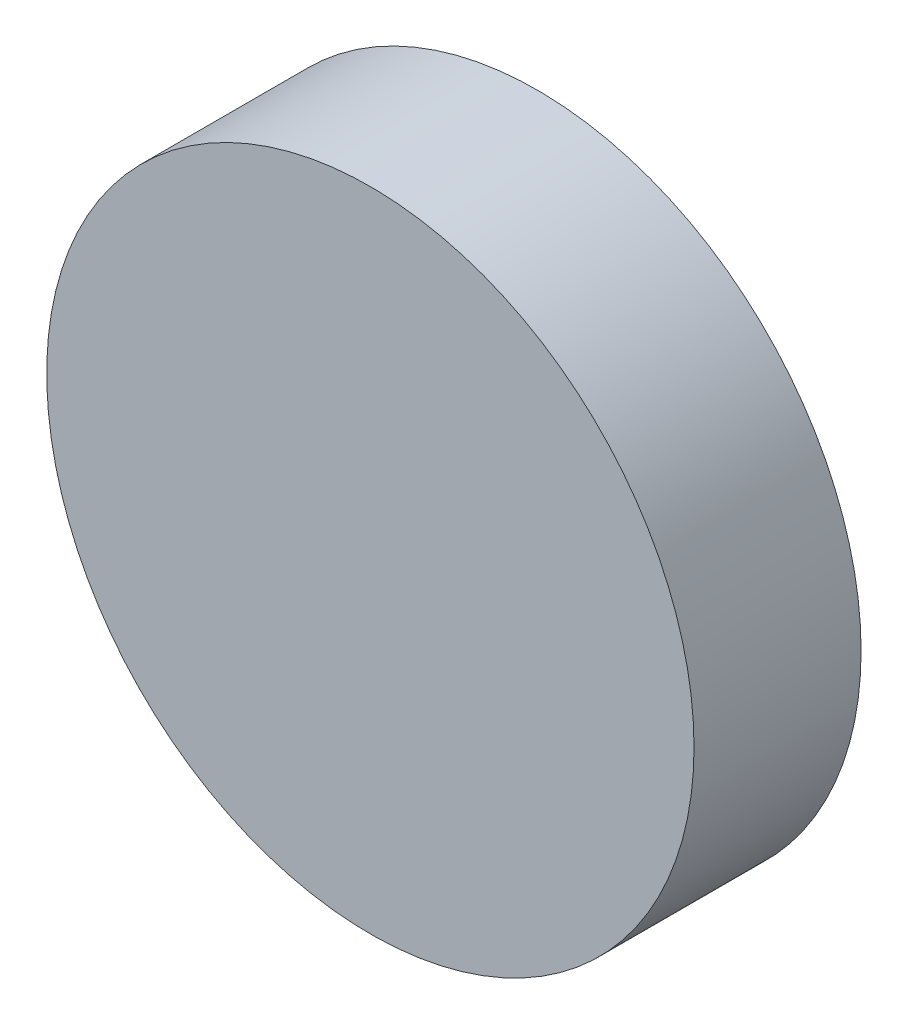
ISO-10303-21;
HEADER;
FILE_DESCRIPTION(('STEP AP214'),'2;1');
FILE_NAME('part.step','',(''),(''),'','','');
FILE_SCHEMA(('AUTOMOTIVE_DESIGN { 1 0 10303 214 1 1 1 1 }'));
ENDSEC;
DATA;
#1=APPLICATION_CONTEXT('core data for automotive mechanical design processes');
#2=APPLICATION_PROTOCOL_DEFINITION('international standard','automotive_design',2000,#1);
#3=PRODUCT_CONTEXT('',#1,'mechanical');
#4=PRODUCT('Part','Part','',(#3));
#5=PRODUCT_RELATED_PRODUCT_CATEGORY('part','',(#4));
#6=PRODUCT_DEFINITION_FORMATION('','',#4);
#7=PRODUCT_DEFINITION_CONTEXT('part definition',#1,'design');
#8=PRODUCT_DEFINITION('design','',#6,#7);
#9=PRODUCT_DEFINITION_SHAPE('','',#8);
#10=(LENGTH_UNIT() NAMED_UNIT(*) SI_UNIT(.MILLI.,.METRE.));
#11=(NAMED_UNIT(*) PLANE_ANGLE_UNIT() SI_UNIT($,.RADIAN.));
#12=(NAMED_UNIT(*) SI_UNIT($,.STERADIAN.) SOLID_ANGLE_UNIT());
#13=UNCERTAINTY_MEASURE_WITH_UNIT(LENGTH_MEASURE(1.E-05),#10,'distance_accuracy_value','');
#14=(GEOMETRIC_REPRESENTATION_CONTEXT(3) GLOBAL_UNCERTAINTY_ASSIGNED_CONTEXT((#13)) GLOBAL_UNIT_ASSIGNED_CONTEXT((#10,
#11,#12)) REPRESENTATION_CONTEXT('',''));
#15=CARTESIAN_POINT('',(0.,0.,0.));
#16=DIRECTION('',(0.,0.,1.));
#17=DIRECTION('',(1.,0.,0.));
#18=AXIS2_PLACEMENT_3D('',#15,#16,#17);
#19=CARTESIAN_POINT('',(0.,0.,4.));
#20=DIRECTION('',(0.,0.,-1.));
#21=DIRECTION('',(-1.,0.,0.));
#22=AXIS2_PLACEMENT_3D('',#19,#20,#21);
#23=CYLINDRICAL_SURFACE('',#22,7.75);
#24=CARTESIAN_POINT('',(0.,0.,4.));
#25=DIRECTION('',(0.,0.,1.));
#26=DIRECTION('',(1.,0.,0.));
#27=AXIS2_PLACEMENT_3D('',#24,#25,#26);
#28=CIRCLE('',#27,7.75);
#29=CARTESIAN_POINT('',(7.75,0.,4.));
#30=VERTEX_POINT('',#29);
#31=EDGE_CURVE('E52',#30,#30,#28,.T.);
#32=ORIENTED_EDGE('',*,*,#31,.F.);
#33=EDGE_LOOP('',(#32));
#34=FACE_BOUND('',#33,.T.);
#35=CARTESIAN_POINT('',(0.,0.,0.));
#36=DIRECTION('',(0.,0.,1.));
#37=DIRECTION('',(1.,0.,0.));
#38=AXIS2_PLACEMENT_3D('',#35,#36,#37);
#39=CIRCLE('',#38,7.75);
#40=CARTESIAN_POINT('',(7.75,0.,0.));
#41=VERTEX_POINT('',#40);
#42=EDGE_CURVE('E57',#41,#41,#39,.T.);
#43=ORIENTED_EDGE('',*,*,#42,.T.);
#44=EDGE_LOOP('',(#43));
#45=FACE_BOUND('',#44,.T.);
#46=ADVANCED_FACE('F39',(#34,#45),#23,.T.);
#47=CARTESIAN_POINT('',(0.,0.,4.));
#48=DIRECTION('',(0.,0.,1.));
#49=DIRECTION('',(1.,0.,0.));
#50=AXIS2_PLACEMENT_3D('',#47,#48,#49);
#51=PLANE('',#50);
#52=ORIENTED_EDGE('',*,*,#31,.T.);
#53=EDGE_LOOP('',(#52));
#54=FACE_BOUND('',#53,.T.);
#55=ADVANCED_FACE('F92',(#54),#51,.T.);
#56=CARTESIAN_POINT('',(0.,0.,0.));
#57=DIRECTION('',(0.,0.,1.));
#58=DIRECTION('',(1.,0.,0.));
#59=AXIS2_PLACEMENT_3D('',#56,#57,#58);
#60=PLANE('',#59);
#61=CARTESIAN_POINT('',(0.,0.,0.));
#62=DIRECTION('',(0.,0.,1.));
#63=DIRECTION('',(1.,0.,0.));
#64=AXIS2_PLACEMENT_3D('',#61,#62,#63);
#65=CIRCLE('',#64,1.08);
#66=CARTESIAN_POINT('',(1.08,0.,0.));
#67=VERTEX_POINT('',#66);
#68=EDGE_CURVE('E60',#67,#67,#65,.F.);
#69=ORIENTED_EDGE('',*,*,#68,.F.);
#70=EDGE_LOOP('',(#69));
#71=FACE_BOUND('',#70,.T.);
#72=ORIENTED_EDGE('',*,*,#42,.F.);
#73=EDGE_LOOP('',(#72));
#74=FACE_BOUND('',#73,.T.);
#75=ADVANCED_FACE('F97',(#71,#74),#60,.F.);
#76=CARTESIAN_POINT('',(0.,0.,3.01));
#77=DIRECTION('',(0.,0.,1.));
#78=DIRECTION('',(0.,-1.,0.));
#79=AXIS2_PLACEMENT_3D('',#76,#77,#78);
#80=CYLINDRICAL_SURFACE('',#79,1.08);
#81=CARTESIAN_POINT('',(0.,0.,0.4));
#82=DIRECTION('',(0.,0.,1.));
#83=DIRECTION('',(0.,-1.,0.));
#84=AXIS2_PLACEMENT_3D('',#81,#82,#83);
#85=CIRCLE('',#84,1.08);
#86=CARTESIAN_POINT('',(0.,-1.08,0.4));
#87=VERTEX_POINT('',#86);
#88=EDGE_CURVE('E71',#87,#87,#85,.T.);
#89=ORIENTED_EDGE('',*,*,#88,.T.);
#90=EDGE_LOOP('',(#89));
#91=FACE_BOUND('',#90,.T.);
#92=ORIENTED_EDGE('',*,*,#68,.T.);
#93=EDGE_LOOP('',(#92));
#94=FACE_BOUND('',#93,.T.);
#95=ADVANCED_FACE('F76',(#91,#94),#80,.F.);
#96=CARTESIAN_POINT('',(0.,0.,2.1));
#97=DIRECTION('',(0.,0.,1.));
#98=DIRECTION('',(0.,1.,0.));
#99=AXIS2_PLACEMENT_3D('',#96,#97,#98);
#100=SPHERICAL_SURFACE('',#99,0.91);
#101=CARTESIAN_POINT('',(0.,0.,2.1));
#102=DIRECTION('',(0.,0.,1.));
#103=DIRECTION('',(0.,-1.,0.));
#104=AXIS2_PLACEMENT_3D('',#101,#102,#103);
#105=CIRCLE('',#104,0.910000000000001);
#106=CARTESIAN_POINT('',(0.,-0.910000000000002,2.1));
#107=VERTEX_POINT('',#106);
#108=EDGE_CURVE('E64',#107,#107,#105,.T.);
#109=ORIENTED_EDGE('',*,*,#108,.F.);
#110=EDGE_LOOP('',(#109));
#111=FACE_BOUND('',#110,.T.);
#112=ADVANCED_FACE('F88',(#111),#100,.F.);
#113=CARTESIAN_POINT('',(0.,0.,3.01));
#114=DIRECTION('',(0.,0.,1.));
#115=DIRECTION('',(0.,-1.,0.));
#116=AXIS2_PLACEMENT_3D('',#113,#114,#115);
#117=CYLINDRICAL_SURFACE('',#116,0.910000000000001);
#118=CARTESIAN_POINT('',(0.,0.,0.45));
#119=DIRECTION('',(0.,0.,-1.));
#120=DIRECTION('',(0.,1.,0.));
#121=AXIS2_PLACEMENT_3D('',#118,#119,#120);
#122=CIRCLE('',#121,0.910000000000001);
#123=CARTESIAN_POINT('',(0.,0.910000000000001,0.45));
#124=VERTEX_POINT('',#123);
#125=EDGE_CURVE('E10',#124,#124,#122,.T.);
#126=ORIENTED_EDGE('',*,*,#125,.T.);
#127=EDGE_LOOP('',(#126));
#128=FACE_BOUND('',#127,.T.);
#129=ORIENTED_EDGE('',*,*,#108,.T.);
#130=EDGE_LOOP('',(#129));
#131=FACE_BOUND('',#130,.T.);
#132=ADVANCED_FACE('F81',(#128,#131),#117,.F.);
#133=CARTESIAN_POINT('',(0.,1.08,0.4));
#134=DIRECTION('',(0.,0.,-1.));
#135=DIRECTION('',(0.,1.,0.));
#136=AXIS2_PLACEMENT_3D('',#133,#134,#135);
#137=PLANE('',#136);
#138=CARTESIAN_POINT('',(0.,0.,0.4));
#139=DIRECTION('',(0.,0.,-1.));
#140=DIRECTION('',(0.,1.,0.));
#141=AXIS2_PLACEMENT_3D('',#138,#139,#140);
#142=CIRCLE('',#141,0.960000000000002);
#143=CARTESIAN_POINT('',(0.,0.960000000000001,0.4));
#144=VERTEX_POINT('',#143);
#145=EDGE_CURVE('E47',#144,#144,#142,.F.);
#146=ORIENTED_EDGE('',*,*,#145,.T.);
#147=EDGE_LOOP('',(#146));
#148=FACE_BOUND('',#147,.T.);
#149=ORIENTED_EDGE('',*,*,#88,.F.);
#150=EDGE_LOOP('',(#149));
#151=FACE_BOUND('',#150,.T.);
#152=ADVANCED_FACE('F79',(#148,#151),#137,.T.);
#153=CARTESIAN_POINT('',(0.,0.,0.45));
#154=DIRECTION('',(0.,0.,-1.));
#155=DIRECTION('',(0.,1.,0.));
#156=AXIS2_PLACEMENT_3D('',#153,#154,#155);
#157=TOROIDAL_SURFACE('',#156,0.960000000000002,0.05);
#158=ORIENTED_EDGE('',*,*,#125,.F.);
#159=EDGE_LOOP('',(#158));
#160=FACE_BOUND('',#159,.T.);
#161=ORIENTED_EDGE('',*,*,#145,.F.);
#162=EDGE_LOOP('',(#161));
#163=FACE_BOUND('',#162,.T.);
#164=ADVANCED_FACE('F41',(#160,#163),#157,.T.);
#165=CLOSED_SHELL('',(#46,#55,#75,#95,#112,#132,#152,#164));
#166=MANIFOLD_SOLID_BREP('B2',#165);
#167=ADVANCED_BREP_SHAPE_REPRESENTATION('',(#18,#166),#14);
#168=SHAPE_DEFINITION_REPRESENTATION(#9,#167);
ENDSEC;
END-ISO-10303-21;
